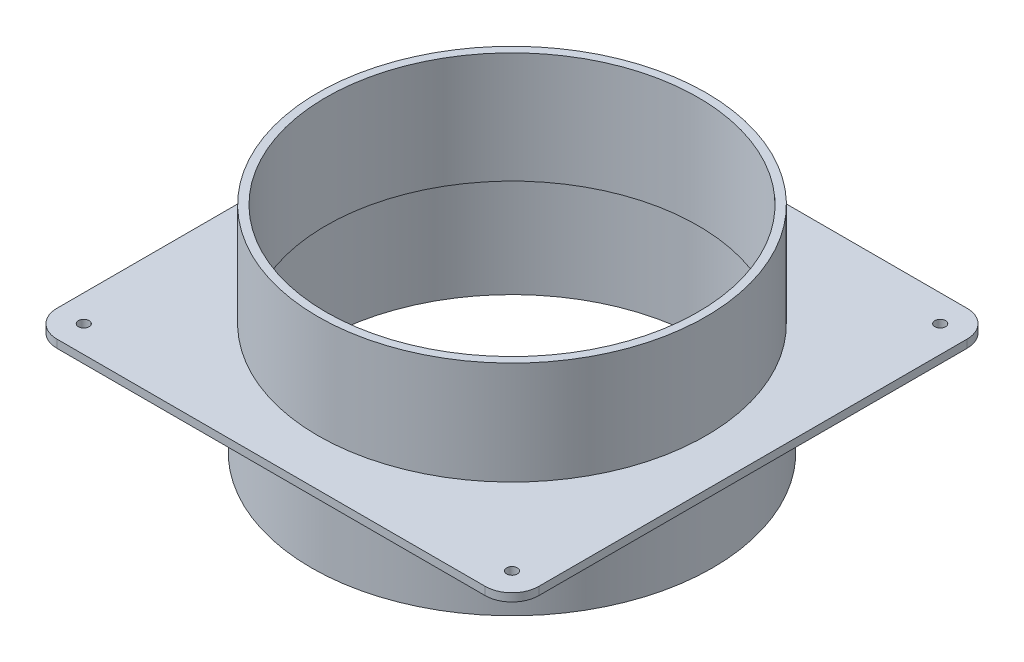
ISO-10303-21;
HEADER;
FILE_DESCRIPTION(('STEP AP214'),'2;1');
FILE_NAME('part.step','',(''),(''),'','','');
FILE_SCHEMA(('AUTOMOTIVE_DESIGN { 1 0 10303 214 1 1 1 1 }'));
ENDSEC;
DATA;
#1=APPLICATION_CONTEXT('core data for automotive mechanical design processes');
#2=APPLICATION_PROTOCOL_DEFINITION('international standard','automotive_design',2000,#1);
#3=PRODUCT_CONTEXT('',#1,'mechanical');
#4=PRODUCT('Part','Part','',(#3));
#5=PRODUCT_RELATED_PRODUCT_CATEGORY('part','',(#4));
#6=PRODUCT_DEFINITION_FORMATION('','',#4);
#7=PRODUCT_DEFINITION_CONTEXT('part definition',#1,'design');
#8=PRODUCT_DEFINITION('design','',#6,#7);
#9=PRODUCT_DEFINITION_SHAPE('','',#8);
#10=(LENGTH_UNIT() NAMED_UNIT(*) SI_UNIT(.MILLI.,.METRE.));
#11=(NAMED_UNIT(*) PLANE_ANGLE_UNIT() SI_UNIT($,.RADIAN.));
#12=(NAMED_UNIT(*) SI_UNIT($,.STERADIAN.) SOLID_ANGLE_UNIT());
#13=UNCERTAINTY_MEASURE_WITH_UNIT(LENGTH_MEASURE(1.E-05),#10,'distance_accuracy_value','');
#14=(GEOMETRIC_REPRESENTATION_CONTEXT(3) GLOBAL_UNCERTAINTY_ASSIGNED_CONTEXT((#13)) GLOBAL_UNIT_ASSIGNED_CONTEXT((#10,
#11,#12)) REPRESENTATION_CONTEXT('',''));
#15=CARTESIAN_POINT('',(0.,0.,0.));
#16=DIRECTION('',(0.,0.,1.));
#17=DIRECTION('',(1.,0.,0.));
#18=AXIS2_PLACEMENT_3D('',#15,#16,#17);
#19=CARTESIAN_POINT('',(0.,-1.5,0.));
#20=DIRECTION('',(0.,1.,0.));
#21=DIRECTION('',(0.,0.,1.));
#22=AXIS2_PLACEMENT_3D('',#19,#20,#21);
#23=PLANE('',#22);
#24=CARTESIAN_POINT('',(0.,-1.5,0.));
#25=DIRECTION('',(0.,1.,0.));
#26=DIRECTION('',(0.,0.,1.));
#27=AXIS2_PLACEMENT_3D('',#24,#25,#26);
#28=CIRCLE('',#27,69.5);
#29=CARTESIAN_POINT('',(0.,-1.5,69.5));
#30=VERTEX_POINT('',#29);
#31=EDGE_CURVE('E144',#30,#30,#28,.T.);
#32=ORIENTED_EDGE('',*,*,#31,.T.);
#33=EDGE_LOOP('',(#32));
#34=FACE_BOUND('',#33,.T.);
#35=CARTESIAN_POINT('',(0.,-1.5,0.));
#36=DIRECTION('',(0.,1.,0.));
#37=DIRECTION('',(0.,0.,1.));
#38=AXIS2_PLACEMENT_3D('',#35,#36,#37);
#39=CIRCLE('',#38,72.);
#40=CARTESIAN_POINT('',(0.,-1.5,72.));
#41=VERTEX_POINT('',#40);
#42=EDGE_CURVE('E11',#41,#41,#39,.T.);
#43=ORIENTED_EDGE('',*,*,#42,.F.);
#44=EDGE_LOOP('',(#43));
#45=FACE_BOUND('',#44,.T.);
#46=ADVANCED_FACE('F34',(#34,#45),#23,.F.);
#47=CARTESIAN_POINT('',(0.,1.5,0.));
#48=DIRECTION('',(0.,1.,0.));
#49=DIRECTION('',(0.,0.,1.));
#50=AXIS2_PLACEMENT_3D('',#47,#48,#49);
#51=PLANE('',#50);
#52=CARTESIAN_POINT('',(80.,1.5,-80.));
#53=DIRECTION('',(0.,1.,0.));
#54=DIRECTION('',(0.,0.,1.));
#55=AXIS2_PLACEMENT_3D('',#52,#53,#54);
#56=CIRCLE('',#55,9.99999999999999);
#57=CARTESIAN_POINT('',(79.9999999999999,1.5,-90.));
#58=VERTEX_POINT('',#57);
#59=CARTESIAN_POINT('',(90.,1.5,-79.9999999999999));
#60=VERTEX_POINT('',#59);
#61=EDGE_CURVE('E102',#58,#60,#56,.F.);
#62=ORIENTED_EDGE('',*,*,#61,.F.);
#63=DIRECTION('',(-1.,0.,0.));
#64=VECTOR('',#63,1.);
#65=CARTESIAN_POINT('',(0.,1.5,-90.));
#66=LINE('',#65,#64);
#67=CARTESIAN_POINT('',(-80.,1.5,-90.));
#68=VERTEX_POINT('',#67);
#69=EDGE_CURVE('E111',#58,#68,#66,.T.);
#70=ORIENTED_EDGE('',*,*,#69,.T.);
#71=CARTESIAN_POINT('',(-80.,1.5,-80.));
#72=DIRECTION('',(0.,1.,0.));
#73=DIRECTION('',(0.,0.,1.));
#74=AXIS2_PLACEMENT_3D('',#71,#72,#73);
#75=CIRCLE('',#74,9.99999999999999);
#76=CARTESIAN_POINT('',(-90.,1.5,-79.9999999999999));
#77=VERTEX_POINT('',#76);
#78=EDGE_CURVE('E116',#68,#77,#75,.T.);
#79=ORIENTED_EDGE('',*,*,#78,.T.);
#80=DIRECTION('',(0.,0.,1.));
#81=VECTOR('',#80,1.);
#82=CARTESIAN_POINT('',(-90.,1.5,0.));
#83=LINE('',#82,#81);
#84=CARTESIAN_POINT('',(-90.,1.5,79.9999999999999));
#85=VERTEX_POINT('',#84);
#86=EDGE_CURVE('E131',#77,#85,#83,.T.);
#87=ORIENTED_EDGE('',*,*,#86,.T.);
#88=CARTESIAN_POINT('',(-80.,1.5,80.));
#89=DIRECTION('',(0.,1.,0.));
#90=DIRECTION('',(0.,0.,1.));
#91=AXIS2_PLACEMENT_3D('',#88,#89,#90);
#92=CIRCLE('',#91,9.99999999999999);
#93=CARTESIAN_POINT('',(-79.9999999999999,1.5,90.));
#94=VERTEX_POINT('',#93);
#95=EDGE_CURVE('E134',#94,#85,#92,.F.);
#96=ORIENTED_EDGE('',*,*,#95,.F.);
#97=DIRECTION('',(-1.,0.,0.));
#98=VECTOR('',#97,1.);
#99=CARTESIAN_POINT('',(0.,1.5,90.));
#100=LINE('',#99,#98);
#101=CARTESIAN_POINT('',(79.9999999999999,1.5,90.));
#102=VERTEX_POINT('',#101);
#103=EDGE_CURVE('E137',#102,#94,#100,.T.);
#104=ORIENTED_EDGE('',*,*,#103,.F.);
#105=CARTESIAN_POINT('',(80.,1.5,80.));
#106=DIRECTION('',(0.,1.,0.));
#107=DIRECTION('',(0.,0.,1.));
#108=AXIS2_PLACEMENT_3D('',#105,#106,#107);
#109=CIRCLE('',#108,9.99999999999999);
#110=CARTESIAN_POINT('',(90.,1.5,79.9999999999999));
#111=VERTEX_POINT('',#110);
#112=EDGE_CURVE('E140',#111,#102,#109,.F.);
#113=ORIENTED_EDGE('',*,*,#112,.F.);
#114=DIRECTION('',(0.,0.,1.));
#115=VECTOR('',#114,1.);
#116=CARTESIAN_POINT('',(90.,1.5,0.));
#117=LINE('',#116,#115);
#118=EDGE_CURVE('E122',#60,#111,#117,.T.);
#119=ORIENTED_EDGE('',*,*,#118,.F.);
#120=EDGE_LOOP('',(#62,#70,#79,#87,#96,#104,#113,#119));
#121=FACE_BOUND('',#120,.T.);
#122=CARTESIAN_POINT('',(-80.,1.5,80.));
#123=DIRECTION('',(0.,1.,0.));
#124=DIRECTION('',(0.,0.,1.));
#125=AXIS2_PLACEMENT_3D('',#122,#123,#124);
#126=CIRCLE('',#125,2.);
#127=CARTESIAN_POINT('',(-80.,1.5,82.));
#128=VERTEX_POINT('',#127);
#129=EDGE_CURVE('E123',#128,#128,#126,.T.);
#130=ORIENTED_EDGE('',*,*,#129,.F.);
#131=EDGE_LOOP('',(#130));
#132=FACE_BOUND('',#131,.T.);
#133=CARTESIAN_POINT('',(80.,1.5,80.));
#134=DIRECTION('',(0.,1.,0.));
#135=DIRECTION('',(0.,0.,1.));
#136=AXIS2_PLACEMENT_3D('',#133,#134,#135);
#137=CIRCLE('',#136,2.);
#138=CARTESIAN_POINT('',(80.,1.5,82.));
#139=VERTEX_POINT('',#138);
#140=EDGE_CURVE('E126',#139,#139,#137,.T.);
#141=ORIENTED_EDGE('',*,*,#140,.F.);
#142=EDGE_LOOP('',(#141));
#143=FACE_BOUND('',#142,.T.);
#144=CARTESIAN_POINT('',(80.,1.5,-79.9999999999999));
#145=DIRECTION('',(0.,1.,0.));
#146=DIRECTION('',(0.,0.,1.));
#147=AXIS2_PLACEMENT_3D('',#144,#145,#146);
#148=CIRCLE('',#147,2.);
#149=CARTESIAN_POINT('',(80.,1.5,-77.9999999999999));
#150=VERTEX_POINT('',#149);
#151=EDGE_CURVE('E194',#150,#150,#148,.T.);
#152=ORIENTED_EDGE('',*,*,#151,.F.);
#153=EDGE_LOOP('',(#152));
#154=FACE_BOUND('',#153,.T.);
#155=CARTESIAN_POINT('',(-80.,1.5,-80.));
#156=DIRECTION('',(0.,1.,0.));
#157=DIRECTION('',(0.,0.,1.));
#158=AXIS2_PLACEMENT_3D('',#155,#156,#157);
#159=CIRCLE('',#158,2.);
#160=CARTESIAN_POINT('',(-80.,1.5,-78.));
#161=VERTEX_POINT('',#160);
#162=EDGE_CURVE('E189',#161,#161,#159,.T.);
#163=ORIENTED_EDGE('',*,*,#162,.F.);
#164=EDGE_LOOP('',(#163));
#165=FACE_BOUND('',#164,.T.);
#166=CARTESIAN_POINT('',(0.,1.5,0.));
#167=DIRECTION('',(0.,1.,0.));
#168=DIRECTION('',(0.,0.,1.));
#169=AXIS2_PLACEMENT_3D('',#166,#167,#168);
#170=CIRCLE('',#169,72.5);
#171=CARTESIAN_POINT('',(0.,1.5,72.5));
#172=VERTEX_POINT('',#171);
#173=EDGE_CURVE('E187',#172,#172,#170,.F.);
#174=ORIENTED_EDGE('',*,*,#173,.T.);
#175=EDGE_LOOP('',(#174));
#176=FACE_BOUND('',#175,.T.);
#177=ADVANCED_FACE('F118',(#121,#132,#143,#154,#165,#176),#51,.T.);
#178=CARTESIAN_POINT('',(80.,-1.5,-80.));
#179=DIRECTION('',(0.,1.,0.));
#180=DIRECTION('',(0.,0.,1.));
#181=AXIS2_PLACEMENT_3D('',#178,#179,#180);
#182=CYLINDRICAL_SURFACE('',#181,9.99999999999999);
#183=DIRECTION('',(0.,1.,0.));
#184=VECTOR('',#183,1.);
#185=CARTESIAN_POINT('',(79.9999999999999,-1.5,-90.));
#186=LINE('',#185,#184);
#187=CARTESIAN_POINT('',(79.9999999999999,-1.5,-90.));
#188=VERTEX_POINT('',#187);
#189=EDGE_CURVE('E97',#188,#58,#186,.T.);
#190=ORIENTED_EDGE('',*,*,#189,.T.);
#191=ORIENTED_EDGE('',*,*,#61,.T.);
#192=DIRECTION('',(0.,1.,0.));
#193=VECTOR('',#192,1.);
#194=CARTESIAN_POINT('',(90.,-1.5,-79.9999999999999));
#195=LINE('',#194,#193);
#196=CARTESIAN_POINT('',(90.,-1.5,-79.9999999999999));
#197=VERTEX_POINT('',#196);
#198=EDGE_CURVE('E43',#197,#60,#195,.T.);
#199=ORIENTED_EDGE('',*,*,#198,.F.);
#200=CARTESIAN_POINT('',(80.,-1.5,-80.));
#201=DIRECTION('',(0.,1.,0.));
#202=DIRECTION('',(0.,0.,1.));
#203=AXIS2_PLACEMENT_3D('',#200,#201,#202);
#204=CIRCLE('',#203,9.99999999999999);
#205=EDGE_CURVE('E104',#188,#197,#204,.F.);
#206=ORIENTED_EDGE('',*,*,#205,.F.);
#207=EDGE_LOOP('',(#190,#191,#199,#206));
#208=FACE_BOUND('',#207,.T.);
#209=ADVANCED_FACE('F99',(#208),#182,.T.);
#210=CARTESIAN_POINT('',(90.,-1.5,0.));
#211=DIRECTION('',(-1.,0.,0.));
#212=DIRECTION('',(0.,0.,1.));
#213=AXIS2_PLACEMENT_3D('',#210,#211,#212);
#214=PLANE('',#213);
#215=ORIENTED_EDGE('',*,*,#198,.T.);
#216=ORIENTED_EDGE('',*,*,#118,.T.);
#217=DIRECTION('',(0.,1.,0.));
#218=VECTOR('',#217,1.);
#219=CARTESIAN_POINT('',(90.,-1.5,79.9999999999999));
#220=LINE('',#219,#218);
#221=CARTESIAN_POINT('',(90.,-1.5,79.9999999999999));
#222=VERTEX_POINT('',#221);
#223=EDGE_CURVE('E176',#222,#111,#220,.T.);
#224=ORIENTED_EDGE('',*,*,#223,.F.);
#225=DIRECTION('',(0.,0.,1.));
#226=VECTOR('',#225,1.);
#227=CARTESIAN_POINT('',(90.,-1.5,0.));
#228=LINE('',#227,#226);
#229=EDGE_CURVE('E50',#197,#222,#228,.T.);
#230=ORIENTED_EDGE('',*,*,#229,.F.);
#231=EDGE_LOOP('',(#215,#216,#224,#230));
#232=FACE_BOUND('',#231,.T.);
#233=ADVANCED_FACE('F258',(#232),#214,.F.);
#234=CARTESIAN_POINT('',(80.,-1.5,80.));
#235=DIRECTION('',(0.,1.,0.));
#236=DIRECTION('',(0.,0.,1.));
#237=AXIS2_PLACEMENT_3D('',#234,#235,#236);
#238=CYLINDRICAL_SURFACE('',#237,9.99999999999999);
#239=ORIENTED_EDGE('',*,*,#223,.T.);
#240=ORIENTED_EDGE('',*,*,#112,.T.);
#241=DIRECTION('',(0.,1.,0.));
#242=VECTOR('',#241,1.);
#243=CARTESIAN_POINT('',(79.9999999999999,-1.5,90.));
#244=LINE('',#243,#242);
#245=CARTESIAN_POINT('',(79.9999999999999,-1.5,90.));
#246=VERTEX_POINT('',#245);
#247=EDGE_CURVE('E178',#246,#102,#244,.T.);
#248=ORIENTED_EDGE('',*,*,#247,.F.);
#249=CARTESIAN_POINT('',(80.,-1.5,80.));
#250=DIRECTION('',(0.,1.,0.));
#251=DIRECTION('',(0.,0.,1.));
#252=AXIS2_PLACEMENT_3D('',#249,#250,#251);
#253=CIRCLE('',#252,9.99999999999999);
#254=EDGE_CURVE('E172',#222,#246,#253,.F.);
#255=ORIENTED_EDGE('',*,*,#254,.F.);
#256=EDGE_LOOP('',(#239,#240,#248,#255));
#257=FACE_BOUND('',#256,.T.);
#258=ADVANCED_FACE('F262',(#257),#238,.T.);
#259=CARTESIAN_POINT('',(0.,-1.5,90.));
#260=DIRECTION('',(0.,0.,-1.));
#261=DIRECTION('',(-1.,0.,0.));
#262=AXIS2_PLACEMENT_3D('',#259,#260,#261);
#263=PLANE('',#262);
#264=ORIENTED_EDGE('',*,*,#247,.T.);
#265=ORIENTED_EDGE('',*,*,#103,.T.);
#266=DIRECTION('',(0.,1.,0.));
#267=VECTOR('',#266,1.);
#268=CARTESIAN_POINT('',(-79.9999999999999,-1.5,90.));
#269=LINE('',#268,#267);
#270=CARTESIAN_POINT('',(-79.9999999999999,-1.5,90.));
#271=VERTEX_POINT('',#270);
#272=EDGE_CURVE('E180',#271,#94,#269,.T.);
#273=ORIENTED_EDGE('',*,*,#272,.F.);
#274=DIRECTION('',(-1.,0.,0.));
#275=VECTOR('',#274,1.);
#276=CARTESIAN_POINT('',(0.,-1.5,90.));
#277=LINE('',#276,#275);
#278=EDGE_CURVE('E170',#246,#271,#277,.T.);
#279=ORIENTED_EDGE('',*,*,#278,.F.);
#280=EDGE_LOOP('',(#264,#265,#273,#279));
#281=FACE_BOUND('',#280,.T.);
#282=ADVANCED_FACE('F269',(#281),#263,.F.);
#283=CARTESIAN_POINT('',(-80.,-1.5,80.));
#284=DIRECTION('',(0.,1.,0.));
#285=DIRECTION('',(0.,0.,1.));
#286=AXIS2_PLACEMENT_3D('',#283,#284,#285);
#287=CYLINDRICAL_SURFACE('',#286,9.99999999999999);
#288=ORIENTED_EDGE('',*,*,#272,.T.);
#289=ORIENTED_EDGE('',*,*,#95,.T.);
#290=DIRECTION('',(0.,1.,0.));
#291=VECTOR('',#290,1.);
#292=CARTESIAN_POINT('',(-90.,-1.5,79.9999999999999));
#293=LINE('',#292,#291);
#294=CARTESIAN_POINT('',(-90.,-1.5,79.9999999999999));
#295=VERTEX_POINT('',#294);
#296=EDGE_CURVE('E182',#295,#85,#293,.T.);
#297=ORIENTED_EDGE('',*,*,#296,.F.);
#298=CARTESIAN_POINT('',(-80.,-1.5,80.));
#299=DIRECTION('',(0.,1.,0.));
#300=DIRECTION('',(0.,0.,1.));
#301=AXIS2_PLACEMENT_3D('',#298,#299,#300);
#302=CIRCLE('',#301,9.99999999999999);
#303=EDGE_CURVE('E168',#271,#295,#302,.F.);
#304=ORIENTED_EDGE('',*,*,#303,.F.);
#305=EDGE_LOOP('',(#288,#289,#297,#304));
#306=FACE_BOUND('',#305,.T.);
#307=ADVANCED_FACE('F273',(#306),#287,.T.);
#308=CARTESIAN_POINT('',(-90.,-1.5,0.));
#309=DIRECTION('',(-1.,0.,0.));
#310=DIRECTION('',(0.,0.,1.));
#311=AXIS2_PLACEMENT_3D('',#308,#309,#310);
#312=PLANE('',#311);
#313=ORIENTED_EDGE('',*,*,#296,.T.);
#314=ORIENTED_EDGE('',*,*,#86,.F.);
#315=DIRECTION('',(0.,1.,0.));
#316=VECTOR('',#315,1.);
#317=CARTESIAN_POINT('',(-90.,-1.5,-79.9999999999999));
#318=LINE('',#317,#316);
#319=CARTESIAN_POINT('',(-90.,-1.5,-79.9999999999999));
#320=VERTEX_POINT('',#319);
#321=EDGE_CURVE('E184',#320,#77,#318,.T.);
#322=ORIENTED_EDGE('',*,*,#321,.F.);
#323=DIRECTION('',(0.,0.,1.));
#324=VECTOR('',#323,1.);
#325=CARTESIAN_POINT('',(-90.,-1.5,0.));
#326=LINE('',#325,#324);
#327=EDGE_CURVE('E165',#320,#295,#326,.T.);
#328=ORIENTED_EDGE('',*,*,#327,.T.);
#329=EDGE_LOOP('',(#313,#314,#322,#328));
#330=FACE_BOUND('',#329,.T.);
#331=ADVANCED_FACE('F276',(#330),#312,.T.);
#332=CARTESIAN_POINT('',(-80.,-1.5,-80.));
#333=DIRECTION('',(0.,1.,0.));
#334=DIRECTION('',(0.,0.,1.));
#335=AXIS2_PLACEMENT_3D('',#332,#333,#334);
#336=CYLINDRICAL_SURFACE('',#335,9.99999999999999);
#337=ORIENTED_EDGE('',*,*,#321,.T.);
#338=ORIENTED_EDGE('',*,*,#78,.F.);
#339=DIRECTION('',(0.,1.,0.));
#340=VECTOR('',#339,1.);
#341=CARTESIAN_POINT('',(-80.,-1.5,-90.));
#342=LINE('',#341,#340);
#343=CARTESIAN_POINT('',(-80.,-1.5,-90.));
#344=VERTEX_POINT('',#343);
#345=EDGE_CURVE('E108',#344,#68,#342,.T.);
#346=ORIENTED_EDGE('',*,*,#345,.F.);
#347=CARTESIAN_POINT('',(-80.,-1.5,-80.));
#348=DIRECTION('',(0.,1.,0.));
#349=DIRECTION('',(0.,0.,1.));
#350=AXIS2_PLACEMENT_3D('',#347,#348,#349);
#351=CIRCLE('',#350,9.99999999999999);
#352=EDGE_CURVE('E162',#344,#320,#351,.T.);
#353=ORIENTED_EDGE('',*,*,#352,.T.);
#354=EDGE_LOOP('',(#337,#338,#346,#353));
#355=FACE_BOUND('',#354,.T.);
#356=ADVANCED_FACE('F278',(#355),#336,.T.);
#357=CARTESIAN_POINT('',(-80.,-1.5,80.));
#358=DIRECTION('',(0.,1.,0.));
#359=DIRECTION('',(0.,0.,1.));
#360=AXIS2_PLACEMENT_3D('',#357,#358,#359);
#361=CYLINDRICAL_SURFACE('',#360,2.);
#362=CARTESIAN_POINT('',(-80.,-1.5,80.));
#363=DIRECTION('',(0.,1.,0.));
#364=DIRECTION('',(0.,0.,1.));
#365=AXIS2_PLACEMENT_3D('',#362,#363,#364);
#366=CIRCLE('',#365,2.);
#367=CARTESIAN_POINT('',(-80.,-1.5,82.));
#368=VERTEX_POINT('',#367);
#369=EDGE_CURVE('E156',#368,#368,#366,.T.);
#370=ORIENTED_EDGE('',*,*,#369,.F.);
#371=EDGE_LOOP('',(#370));
#372=FACE_BOUND('',#371,.T.);
#373=ORIENTED_EDGE('',*,*,#129,.T.);
#374=EDGE_LOOP('',(#373));
#375=FACE_BOUND('',#374,.T.);
#376=ADVANCED_FACE('F280',(#372,#375),#361,.F.);
#377=CARTESIAN_POINT('',(80.,-1.5,80.));
#378=DIRECTION('',(0.,1.,0.));
#379=DIRECTION('',(0.,0.,1.));
#380=AXIS2_PLACEMENT_3D('',#377,#378,#379);
#381=CYLINDRICAL_SURFACE('',#380,2.);
#382=CARTESIAN_POINT('',(80.,-1.5,80.));
#383=DIRECTION('',(0.,1.,0.));
#384=DIRECTION('',(0.,0.,1.));
#385=AXIS2_PLACEMENT_3D('',#382,#383,#384);
#386=CIRCLE('',#385,2.);
#387=CARTESIAN_POINT('',(80.,-1.5,82.));
#388=VERTEX_POINT('',#387);
#389=EDGE_CURVE('E153',#388,#388,#386,.T.);
#390=ORIENTED_EDGE('',*,*,#389,.F.);
#391=EDGE_LOOP('',(#390));
#392=FACE_BOUND('',#391,.T.);
#393=ORIENTED_EDGE('',*,*,#140,.T.);
#394=EDGE_LOOP('',(#393));
#395=FACE_BOUND('',#394,.T.);
#396=ADVANCED_FACE('F209',(#392,#395),#381,.F.);
#397=CARTESIAN_POINT('',(80.,-1.5,-79.9999999999999));
#398=DIRECTION('',(0.,1.,0.));
#399=DIRECTION('',(0.,0.,1.));
#400=AXIS2_PLACEMENT_3D('',#397,#398,#399);
#401=CYLINDRICAL_SURFACE('',#400,2.);
#402=CARTESIAN_POINT('',(80.,-1.5,-79.9999999999999));
#403=DIRECTION('',(0.,1.,0.));
#404=DIRECTION('',(0.,0.,1.));
#405=AXIS2_PLACEMENT_3D('',#402,#403,#404);
#406=CIRCLE('',#405,2.);
#407=CARTESIAN_POINT('',(80.,-1.5,-77.9999999999999));
#408=VERTEX_POINT('',#407);
#409=EDGE_CURVE('E150',#408,#408,#406,.T.);
#410=ORIENTED_EDGE('',*,*,#409,.F.);
#411=EDGE_LOOP('',(#410));
#412=FACE_BOUND('',#411,.T.);
#413=ORIENTED_EDGE('',*,*,#151,.T.);
#414=EDGE_LOOP('',(#413));
#415=FACE_BOUND('',#414,.T.);
#416=ADVANCED_FACE('F220',(#412,#415),#401,.F.);
#417=CARTESIAN_POINT('',(-80.,-1.5,-80.));
#418=DIRECTION('',(0.,1.,0.));
#419=DIRECTION('',(0.,0.,1.));
#420=AXIS2_PLACEMENT_3D('',#417,#418,#419);
#421=CYLINDRICAL_SURFACE('',#420,2.);
#422=CARTESIAN_POINT('',(-80.,-1.5,-80.));
#423=DIRECTION('',(0.,1.,0.));
#424=DIRECTION('',(0.,0.,1.));
#425=AXIS2_PLACEMENT_3D('',#422,#423,#424);
#426=CIRCLE('',#425,2.);
#427=CARTESIAN_POINT('',(-80.,-1.5,-78.));
#428=VERTEX_POINT('',#427);
#429=EDGE_CURVE('E147',#428,#428,#426,.T.);
#430=ORIENTED_EDGE('',*,*,#429,.F.);
#431=EDGE_LOOP('',(#430));
#432=FACE_BOUND('',#431,.T.);
#433=ORIENTED_EDGE('',*,*,#162,.T.);
#434=EDGE_LOOP('',(#433));
#435=FACE_BOUND('',#434,.T.);
#436=ADVANCED_FACE('F218',(#432,#435),#421,.F.);
#437=CARTESIAN_POINT('',(0.,-1.5,0.));
#438=DIRECTION('',(0.,1.,0.));
#439=DIRECTION('',(0.,0.,1.));
#440=AXIS2_PLACEMENT_3D('',#437,#438,#439);
#441=CYLINDRICAL_SURFACE('',#440,69.5);
#442=CARTESIAN_POINT('',(0.,40.,0.));
#443=DIRECTION('',(0.,1.,0.));
#444=DIRECTION('',(0.,0.,1.));
#445=AXIS2_PLACEMENT_3D('',#442,#443,#444);
#446=CIRCLE('',#445,69.5);
#447=CARTESIAN_POINT('',(0.,40.,69.5));
#448=VERTEX_POINT('',#447);
#449=EDGE_CURVE('E197',#448,#448,#446,.T.);
#450=ORIENTED_EDGE('',*,*,#449,.T.);
#451=EDGE_LOOP('',(#450));
#452=FACE_BOUND('',#451,.T.);
#453=ORIENTED_EDGE('',*,*,#31,.F.);
#454=EDGE_LOOP('',(#453));
#455=FACE_BOUND('',#454,.T.);
#456=ADVANCED_FACE('F36',(#452,#455),#441,.F.);
#457=CARTESIAN_POINT('',(0.,-1.5,-90.));
#458=DIRECTION('',(0.,0.,-1.));
#459=DIRECTION('',(-1.,0.,0.));
#460=AXIS2_PLACEMENT_3D('',#457,#458,#459);
#461=PLANE('',#460);
#462=ORIENTED_EDGE('',*,*,#345,.T.);
#463=ORIENTED_EDGE('',*,*,#69,.F.);
#464=ORIENTED_EDGE('',*,*,#189,.F.);
#465=DIRECTION('',(-1.,0.,0.));
#466=VECTOR('',#465,1.);
#467=CARTESIAN_POINT('',(0.,-1.5,-90.));
#468=LINE('',#467,#466);
#469=EDGE_CURVE('E160',#188,#344,#468,.T.);
#470=ORIENTED_EDGE('',*,*,#469,.T.);
#471=EDGE_LOOP('',(#462,#463,#464,#470));
#472=FACE_BOUND('',#471,.T.);
#473=ADVANCED_FACE('F112',(#472),#461,.T.);
#474=CARTESIAN_POINT('',(0.,-1.5,0.));
#475=DIRECTION('',(0.,1.,0.));
#476=DIRECTION('',(0.,0.,1.));
#477=AXIS2_PLACEMENT_3D('',#474,#475,#476);
#478=CIRCLE('',#477,75.);
#479=CARTESIAN_POINT('',(0.,-1.5,75.));
#480=VERTEX_POINT('',#479);
#481=EDGE_CURVE('E38',#480,#480,#478,.T.);
#482=ORIENTED_EDGE('',*,*,#481,.T.);
#483=EDGE_LOOP('',(#482));
#484=FACE_BOUND('',#483,.T.);
#485=ORIENTED_EDGE('',*,*,#429,.T.);
#486=EDGE_LOOP('',(#485));
#487=FACE_BOUND('',#486,.T.);
#488=ORIENTED_EDGE('',*,*,#409,.T.);
#489=EDGE_LOOP('',(#488));
#490=FACE_BOUND('',#489,.T.);
#491=ORIENTED_EDGE('',*,*,#389,.T.);
#492=EDGE_LOOP('',(#491));
#493=FACE_BOUND('',#492,.T.);
#494=ORIENTED_EDGE('',*,*,#369,.T.);
#495=EDGE_LOOP('',(#494));
#496=FACE_BOUND('',#495,.T.);
#497=ORIENTED_EDGE('',*,*,#205,.T.);
#498=ORIENTED_EDGE('',*,*,#229,.T.);
#499=ORIENTED_EDGE('',*,*,#254,.T.);
#500=ORIENTED_EDGE('',*,*,#278,.T.);
#501=ORIENTED_EDGE('',*,*,#303,.T.);
#502=ORIENTED_EDGE('',*,*,#327,.F.);
#503=ORIENTED_EDGE('',*,*,#352,.F.);
#504=ORIENTED_EDGE('',*,*,#469,.F.);
#505=EDGE_LOOP('',(#497,#498,#499,#500,#501,#502,#503,#504));
#506=FACE_BOUND('',#505,.T.);
#507=ADVANCED_FACE('F233',(#484,#487,#490,#493,#496,#506),#23,.F.);
#508=CARTESIAN_POINT('',(0.,40.,0.));
#509=DIRECTION('',(0.,1.,0.));
#510=DIRECTION('',(0.,0.,1.));
#511=AXIS2_PLACEMENT_3D('',#508,#509,#510);
#512=PLANE('',#511);
#513=CARTESIAN_POINT('',(0.,40.,0.));
#514=DIRECTION('',(0.,1.,0.));
#515=DIRECTION('',(0.,0.,1.));
#516=AXIS2_PLACEMENT_3D('',#513,#514,#515);
#517=CIRCLE('',#516,72.5);
#518=CARTESIAN_POINT('',(0.,40.,72.5));
#519=VERTEX_POINT('',#518);
#520=EDGE_CURVE('E190',#519,#519,#517,.T.);
#521=ORIENTED_EDGE('',*,*,#520,.T.);
#522=EDGE_LOOP('',(#521));
#523=FACE_BOUND('',#522,.T.);
#524=ORIENTED_EDGE('',*,*,#449,.F.);
#525=EDGE_LOOP('',(#524));
#526=FACE_BOUND('',#525,.T.);
#527=ADVANCED_FACE('F239',(#523,#526),#512,.T.);
#528=CARTESIAN_POINT('',(0.,40.,0.));
#529=DIRECTION('',(0.,-1.,0.));
#530=DIRECTION('',(0.,0.,-1.));
#531=AXIS2_PLACEMENT_3D('',#528,#529,#530);
#532=CYLINDRICAL_SURFACE('',#531,72.5);
#533=ORIENTED_EDGE('',*,*,#173,.F.);
#534=EDGE_LOOP('',(#533));
#535=FACE_BOUND('',#534,.T.);
#536=ORIENTED_EDGE('',*,*,#520,.F.);
#537=EDGE_LOOP('',(#536));
#538=FACE_BOUND('',#537,.T.);
#539=ADVANCED_FACE('F245',(#535,#538),#532,.T.);
#540=CARTESIAN_POINT('',(0.,-40.,0.));
#541=DIRECTION('',(0.,1.,0.));
#542=DIRECTION('',(0.,0.,1.));
#543=AXIS2_PLACEMENT_3D('',#540,#541,#542);
#544=CYLINDRICAL_SURFACE('',#543,75.);
#545=CARTESIAN_POINT('',(0.,-40.,0.));
#546=DIRECTION('',(0.,1.,0.));
#547=DIRECTION('',(0.,0.,1.));
#548=AXIS2_PLACEMENT_3D('',#545,#546,#547);
#549=CIRCLE('',#548,75.);
#550=CARTESIAN_POINT('',(0.,-40.,75.));
#551=VERTEX_POINT('',#550);
#552=EDGE_CURVE('E389',#551,#551,#549,.T.);
#553=ORIENTED_EDGE('',*,*,#552,.T.);
#554=EDGE_LOOP('',(#553));
#555=FACE_BOUND('',#554,.T.);
#556=ORIENTED_EDGE('',*,*,#481,.F.);
#557=EDGE_LOOP('',(#556));
#558=FACE_BOUND('',#557,.T.);
#559=ADVANCED_FACE('F341',(#555,#558),#544,.T.);
#560=CARTESIAN_POINT('',(0.,-40.,0.));
#561=DIRECTION('',(0.,1.,0.));
#562=DIRECTION('',(0.,0.,1.));
#563=AXIS2_PLACEMENT_3D('',#560,#561,#562);
#564=CYLINDRICAL_SURFACE('',#563,72.);
#565=CARTESIAN_POINT('',(0.,-40.,0.));
#566=DIRECTION('',(0.,1.,0.));
#567=DIRECTION('',(0.,0.,1.));
#568=AXIS2_PLACEMENT_3D('',#565,#566,#567);
#569=CIRCLE('',#568,72.);
#570=CARTESIAN_POINT('',(0.,-40.,72.));
#571=VERTEX_POINT('',#570);
#572=EDGE_CURVE('E386',#571,#571,#569,.T.);
#573=ORIENTED_EDGE('',*,*,#572,.F.);
#574=EDGE_LOOP('',(#573));
#575=FACE_BOUND('',#574,.T.);
#576=ORIENTED_EDGE('',*,*,#42,.T.);
#577=EDGE_LOOP('',(#576));
#578=FACE_BOUND('',#577,.T.);
#579=ADVANCED_FACE('F359',(#575,#578),#564,.F.);
#580=CARTESIAN_POINT('',(0.,-40.,0.));
#581=DIRECTION('',(0.,1.,0.));
#582=DIRECTION('',(0.,0.,1.));
#583=AXIS2_PLACEMENT_3D('',#580,#581,#582);
#584=PLANE('',#583);
#585=ORIENTED_EDGE('',*,*,#572,.T.);
#586=EDGE_LOOP('',(#585));
#587=FACE_BOUND('',#586,.T.);
#588=ORIENTED_EDGE('',*,*,#552,.F.);
#589=EDGE_LOOP('',(#588));
#590=FACE_BOUND('',#589,.T.);
#591=ADVANCED_FACE('F369',(#587,#590),#584,.F.);
#592=CLOSED_SHELL('',(#46,#177,#209,#233,#258,#282,#307,#331,#356,#376,#396,#416,#436,#456,#473,
#507,#527,#539,#559,#579,#591));
#593=MANIFOLD_SOLID_BREP('B2',#592);
#594=ADVANCED_BREP_SHAPE_REPRESENTATION('',(#18,#593),#14);
#595=SHAPE_DEFINITION_REPRESENTATION(#9,#594);
ENDSEC;
END-ISO-10303-21;
